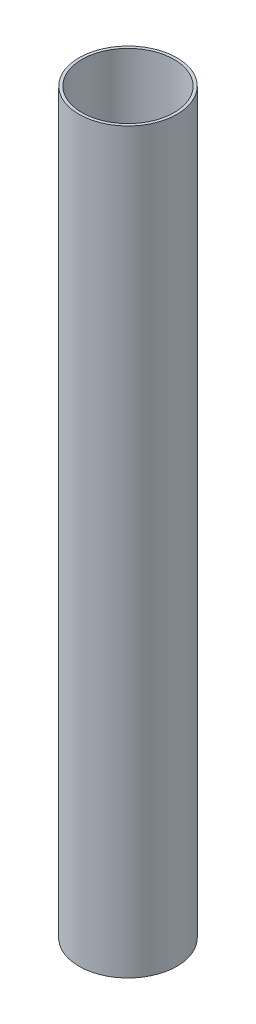
ISO-10303-21;
HEADER;
FILE_DESCRIPTION(('STEP AP214'),'2;1');
FILE_NAME('part.step','',(''),(''),'','','');
FILE_SCHEMA(('AUTOMOTIVE_DESIGN { 1 0 10303 214 1 1 1 1 }'));
ENDSEC;
DATA;
#1=APPLICATION_CONTEXT('core data for automotive mechanical design processes');
#2=APPLICATION_PROTOCOL_DEFINITION('international standard','automotive_design',2000,#1);
#3=PRODUCT_CONTEXT('',#1,'mechanical');
#4=PRODUCT('Part','Part','',(#3));
#5=PRODUCT_RELATED_PRODUCT_CATEGORY('part','',(#4));
#6=PRODUCT_DEFINITION_FORMATION('','',#4);
#7=PRODUCT_DEFINITION_CONTEXT('part definition',#1,'design');
#8=PRODUCT_DEFINITION('design','',#6,#7);
#9=PRODUCT_DEFINITION_SHAPE('','',#8);
#10=(LENGTH_UNIT() NAMED_UNIT(*) SI_UNIT(.MILLI.,.METRE.));
#11=(NAMED_UNIT(*) PLANE_ANGLE_UNIT() SI_UNIT($,.RADIAN.));
#12=(NAMED_UNIT(*) SI_UNIT($,.STERADIAN.) SOLID_ANGLE_UNIT());
#13=UNCERTAINTY_MEASURE_WITH_UNIT(LENGTH_MEASURE(1.E-05),#10,'distance_accuracy_value','');
#14=(GEOMETRIC_REPRESENTATION_CONTEXT(3) GLOBAL_UNCERTAINTY_ASSIGNED_CONTEXT((#13)) GLOBAL_UNIT_ASSIGNED_CONTEXT((#10,
#11,#12)) REPRESENTATION_CONTEXT('',''));
#15=CARTESIAN_POINT('',(0.,0.,0.));
#16=DIRECTION('',(0.,0.,1.));
#17=DIRECTION('',(1.,0.,0.));
#18=AXIS2_PLACEMENT_3D('',#15,#16,#17);
#19=CARTESIAN_POINT('',(0.,406.4,0.));
#20=DIRECTION('',(0.,1.,0.));
#21=DIRECTION('',(0.,0.,1.));
#22=AXIS2_PLACEMENT_3D('',#19,#20,#21);
#23=PLANE('',#22);
#24=CARTESIAN_POINT('',(0.,406.4,0.));
#25=DIRECTION('',(0.,1.,0.));
#26=DIRECTION('',(0.,0.,1.));
#27=AXIS2_PLACEMENT_3D('',#24,#25,#26);
#28=CIRCLE('',#27,53.975);
#29=CARTESIAN_POINT('',(0.,406.4,53.975));
#30=VERTEX_POINT('',#29);
#31=EDGE_CURVE('E10',#30,#30,#28,.T.);
#32=ORIENTED_EDGE('',*,*,#31,.T.);
#33=EDGE_LOOP('',(#32));
#34=FACE_BOUND('',#33,.T.);
#35=CARTESIAN_POINT('',(0.,406.4,0.));
#36=DIRECTION('',(0.,1.,0.));
#37=DIRECTION('',(0.,0.,1.));
#38=AXIS2_PLACEMENT_3D('',#35,#36,#37);
#39=CIRCLE('',#38,50.8);
#40=CARTESIAN_POINT('',(0.,406.4,50.8));
#41=VERTEX_POINT('',#40);
#42=EDGE_CURVE('E49',#41,#41,#39,.T.);
#43=ORIENTED_EDGE('',*,*,#42,.F.);
#44=EDGE_LOOP('',(#43));
#45=FACE_BOUND('',#44,.T.);
#46=ADVANCED_FACE('F35',(#34,#45),#23,.T.);
#47=CARTESIAN_POINT('',(0.,-406.4,0.));
#48=DIRECTION('',(0.,1.,0.));
#49=DIRECTION('',(0.,0.,1.));
#50=AXIS2_PLACEMENT_3D('',#47,#48,#49);
#51=PLANE('',#50);
#52=CARTESIAN_POINT('',(0.,-406.4,0.));
#53=DIRECTION('',(0.,1.,0.));
#54=DIRECTION('',(0.,0.,1.));
#55=AXIS2_PLACEMENT_3D('',#52,#53,#54);
#56=CIRCLE('',#55,53.975);
#57=CARTESIAN_POINT('',(0.,-406.4,53.975));
#58=VERTEX_POINT('',#57);
#59=EDGE_CURVE('E39',#58,#58,#56,.T.);
#60=ORIENTED_EDGE('',*,*,#59,.F.);
#61=EDGE_LOOP('',(#60));
#62=FACE_BOUND('',#61,.T.);
#63=CARTESIAN_POINT('',(0.,-406.4,0.));
#64=DIRECTION('',(0.,1.,0.));
#65=DIRECTION('',(0.,0.,1.));
#66=AXIS2_PLACEMENT_3D('',#63,#64,#65);
#67=CIRCLE('',#66,50.8);
#68=CARTESIAN_POINT('',(0.,-406.4,50.8));
#69=VERTEX_POINT('',#68);
#70=EDGE_CURVE('E51',#69,#69,#67,.T.);
#71=ORIENTED_EDGE('',*,*,#70,.T.);
#72=EDGE_LOOP('',(#71));
#73=FACE_BOUND('',#72,.T.);
#74=ADVANCED_FACE('F64',(#62,#73),#51,.F.);
#75=CARTESIAN_POINT('',(0.,406.4,0.));
#76=DIRECTION('',(0.,-1.,0.));
#77=DIRECTION('',(0.,0.,-1.));
#78=AXIS2_PLACEMENT_3D('',#75,#76,#77);
#79=CYLINDRICAL_SURFACE('',#78,53.975);
#80=ORIENTED_EDGE('',*,*,#31,.F.);
#81=EDGE_LOOP('',(#80));
#82=FACE_BOUND('',#81,.T.);
#83=ORIENTED_EDGE('',*,*,#59,.T.);
#84=EDGE_LOOP('',(#83));
#85=FACE_BOUND('',#84,.T.);
#86=ADVANCED_FACE('F37',(#82,#85),#79,.T.);
#87=CARTESIAN_POINT('',(0.,406.4,0.));
#88=DIRECTION('',(0.,-1.,0.));
#89=DIRECTION('',(0.,0.,-1.));
#90=AXIS2_PLACEMENT_3D('',#87,#88,#89);
#91=CYLINDRICAL_SURFACE('',#90,50.8);
#92=ORIENTED_EDGE('',*,*,#42,.T.);
#93=EDGE_LOOP('',(#92));
#94=FACE_BOUND('',#93,.T.);
#95=ORIENTED_EDGE('',*,*,#70,.F.);
#96=EDGE_LOOP('',(#95));
#97=FACE_BOUND('',#96,.T.);
#98=ADVANCED_FACE('F60',(#94,#97),#91,.F.);
#99=CLOSED_SHELL('',(#46,#74,#86,#98));
#100=MANIFOLD_SOLID_BREP('B2',#99);
#101=ADVANCED_BREP_SHAPE_REPRESENTATION('',(#18,#100),#14);
#102=SHAPE_DEFINITION_REPRESENTATION(#9,#101);
ENDSEC;
END-ISO-10303-21;
